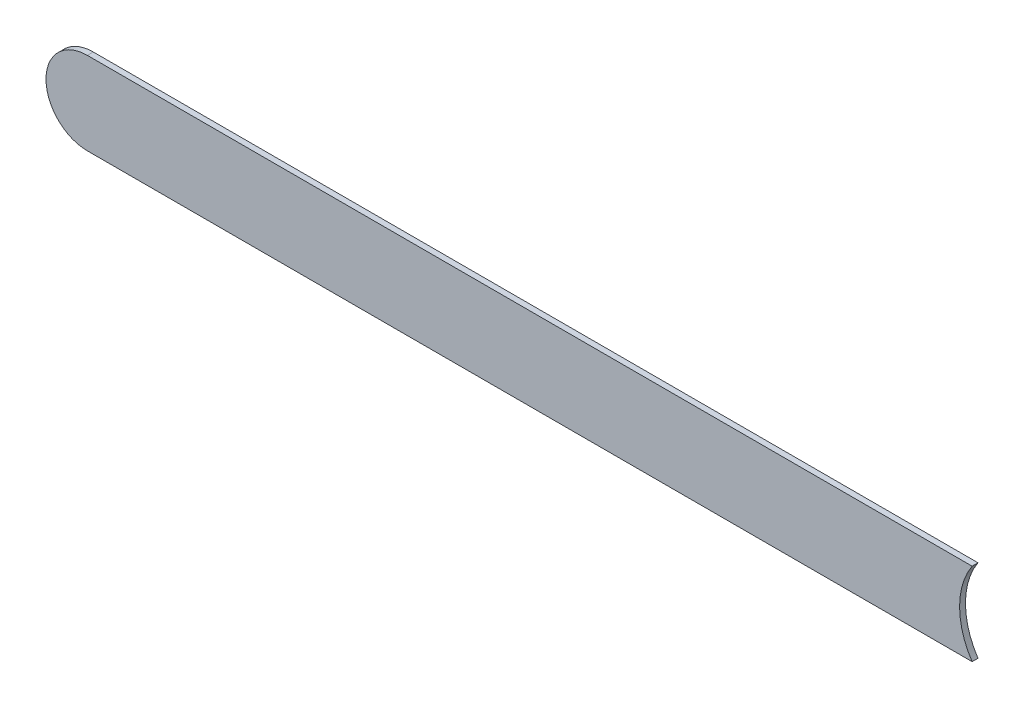
ISO-10303-21;
HEADER;
FILE_DESCRIPTION(('STEP AP214'),'2;1');
FILE_NAME('part.step','',(''),(''),'','','');
FILE_SCHEMA(('AUTOMOTIVE_DESIGN { 1 0 10303 214 1 1 1 1 }'));
ENDSEC;
DATA;
#1=APPLICATION_CONTEXT('core data for automotive mechanical design processes');
#2=APPLICATION_PROTOCOL_DEFINITION('international standard','automotive_design',2000,#1);
#3=PRODUCT_CONTEXT('',#1,'mechanical');
#4=PRODUCT('Part','Part','',(#3));
#5=PRODUCT_RELATED_PRODUCT_CATEGORY('part','',(#4));
#6=PRODUCT_DEFINITION_FORMATION('','',#4);
#7=PRODUCT_DEFINITION_CONTEXT('part definition',#1,'design');
#8=PRODUCT_DEFINITION('design','',#6,#7);
#9=PRODUCT_DEFINITION_SHAPE('','',#8);
#10=(LENGTH_UNIT() NAMED_UNIT(*) SI_UNIT(.MILLI.,.METRE.));
#11=(NAMED_UNIT(*) PLANE_ANGLE_UNIT() SI_UNIT($,.RADIAN.));
#12=(NAMED_UNIT(*) SI_UNIT($,.STERADIAN.) SOLID_ANGLE_UNIT());
#13=UNCERTAINTY_MEASURE_WITH_UNIT(LENGTH_MEASURE(1.E-05),#10,'distance_accuracy_value','');
#14=(GEOMETRIC_REPRESENTATION_CONTEXT(3) GLOBAL_UNCERTAINTY_ASSIGNED_CONTEXT((#13)) GLOBAL_UNIT_ASSIGNED_CONTEXT((#10,
#11,#12)) REPRESENTATION_CONTEXT('',''));
#15=CARTESIAN_POINT('',(0.,0.,0.));
#16=DIRECTION('',(0.,0.,1.));
#17=DIRECTION('',(1.,0.,0.));
#18=AXIS2_PLACEMENT_3D('',#15,#16,#17);
#19=CARTESIAN_POINT('',(42.38801022,114.2380113,0.));
#20=DIRECTION('',(0.,1.,0.));
#21=DIRECTION('',(1.,0.,0.));
#22=AXIS2_PLACEMENT_3D('',#19,#20,#21);
#23=PLANE('',#22);
#24=DIRECTION('',(1.,0.,0.));
#25=VECTOR('',#24,1.);
#26=CARTESIAN_POINT('',(42.38801022,114.2380113,0.03556));
#27=LINE('',#26,#25);
#28=CARTESIAN_POINT('',(42.38801022,114.2380113,0.03556));
#29=VERTEX_POINT('',#28);
#30=CARTESIAN_POINT('',(47.7368386096541,114.2380113,0.03556));
#31=VERTEX_POINT('',#30);
#32=EDGE_CURVE('E11',#29,#31,#27,.T.);
#33=ORIENTED_EDGE('',*,*,#32,.F.);
#34=DIRECTION('',(0.,0.,1.));
#35=VECTOR('',#34,1.);
#36=CARTESIAN_POINT('',(42.38801022,114.2380113,0.));
#37=LINE('',#36,#35);
#38=CARTESIAN_POINT('',(42.38801022,114.2380113,0.));
#39=VERTEX_POINT('',#38);
#40=EDGE_CURVE('E24',#39,#29,#37,.T.);
#41=ORIENTED_EDGE('',*,*,#40,.F.);
#42=DIRECTION('',(1.,0.,0.));
#43=VECTOR('',#42,1.);
#44=CARTESIAN_POINT('',(42.38801022,114.2380113,0.));
#45=LINE('',#44,#43);
#46=CARTESIAN_POINT('',(47.7368386096541,114.2380113,0.));
#47=VERTEX_POINT('',#46);
#48=EDGE_CURVE('E75',#39,#47,#45,.T.);
#49=ORIENTED_EDGE('',*,*,#48,.T.);
#50=DIRECTION('',(0.,0.,1.));
#51=VECTOR('',#50,1.);
#52=CARTESIAN_POINT('',(47.7368386096541,114.2380113,0.));
#53=LINE('',#52,#51);
#54=EDGE_CURVE('E37',#47,#31,#53,.T.);
#55=ORIENTED_EDGE('',*,*,#54,.T.);
#56=EDGE_LOOP('',(#33,#41,#49,#55));
#57=FACE_BOUND('',#56,.T.);
#58=ADVANCED_FACE('F17',(#57),#23,.F.);
#59=CARTESIAN_POINT('',(48.1110036,114.4880108,0.));
#60=DIRECTION('',(0.,0.,-1.));
#61=DIRECTION('',(1.,0.,0.));
#62=AXIS2_PLACEMENT_3D('',#59,#60,#61);
#63=CYLINDRICAL_SURFACE('',#62,0.4499991);
#64=DIRECTION('',(0.,0.,1.));
#65=VECTOR('',#64,1.);
#66=CARTESIAN_POINT('',(47.7368386096541,114.7380103,0.));
#67=LINE('',#66,#65);
#68=CARTESIAN_POINT('',(47.7368386096541,114.7380103,0.));
#69=VERTEX_POINT('',#68);
#70=CARTESIAN_POINT('',(47.7368386096541,114.7380103,0.03556));
#71=VERTEX_POINT('',#70);
#72=EDGE_CURVE('E67',#69,#71,#67,.T.);
#73=ORIENTED_EDGE('',*,*,#72,.T.);
#74=CARTESIAN_POINT('',(48.1110036,114.4880108,0.03556));
#75=DIRECTION('',(0.,0.,1.));
#76=DIRECTION('',(1.,0.,0.));
#77=AXIS2_PLACEMENT_3D('',#74,#75,#76);
#78=CIRCLE('',#77,0.4499991);
#79=EDGE_CURVE('E82',#71,#31,#78,.T.);
#80=ORIENTED_EDGE('',*,*,#79,.T.);
#81=ORIENTED_EDGE('',*,*,#54,.F.);
#82=CARTESIAN_POINT('',(48.1110036,114.4880108,0.));
#83=DIRECTION('',(0.,0.,1.));
#84=DIRECTION('',(1.,0.,0.));
#85=AXIS2_PLACEMENT_3D('',#82,#83,#84);
#86=CIRCLE('',#85,0.4499991);
#87=EDGE_CURVE('E80',#69,#47,#86,.T.);
#88=ORIENTED_EDGE('',*,*,#87,.F.);
#89=EDGE_LOOP('',(#73,#80,#81,#88));
#90=FACE_BOUND('',#89,.T.);
#91=ADVANCED_FACE('F88',(#90),#63,.F.);
#92=CARTESIAN_POINT('',(47.7368386096541,114.7380103,0.));
#93=DIRECTION('',(0.,-1.,0.));
#94=DIRECTION('',(-1.,0.,0.));
#95=AXIS2_PLACEMENT_3D('',#92,#93,#94);
#96=PLANE('',#95);
#97=DIRECTION('',(-1.,0.,0.));
#98=VECTOR('',#97,1.);
#99=CARTESIAN_POINT('',(48.1110036,114.7380103,0.03556));
#100=LINE('',#99,#98);
#101=CARTESIAN_POINT('',(42.38801022,114.7380103,0.03556));
#102=VERTEX_POINT('',#101);
#103=EDGE_CURVE('E71',#71,#102,#100,.T.);
#104=ORIENTED_EDGE('',*,*,#103,.F.);
#105=ORIENTED_EDGE('',*,*,#72,.F.);
#106=DIRECTION('',(-1.,0.,0.));
#107=VECTOR('',#106,1.);
#108=CARTESIAN_POINT('',(48.1110036,114.7380103,0.));
#109=LINE('',#108,#107);
#110=CARTESIAN_POINT('',(42.38801022,114.7380103,0.));
#111=VERTEX_POINT('',#110);
#112=EDGE_CURVE('E63',#69,#111,#109,.T.);
#113=ORIENTED_EDGE('',*,*,#112,.T.);
#114=DIRECTION('',(0.,0.,1.));
#115=VECTOR('',#114,1.);
#116=CARTESIAN_POINT('',(42.38801022,114.7380103,0.));
#117=LINE('',#116,#115);
#118=EDGE_CURVE('E53',#111,#102,#117,.T.);
#119=ORIENTED_EDGE('',*,*,#118,.T.);
#120=EDGE_LOOP('',(#104,#105,#113,#119));
#121=FACE_BOUND('',#120,.T.);
#122=ADVANCED_FACE('F66',(#121),#96,.F.);
#123=CARTESIAN_POINT('',(42.38801022,114.4880108,0.));
#124=DIRECTION('',(0.,0.,-1.));
#125=DIRECTION('',(0.,1.,0.));
#126=AXIS2_PLACEMENT_3D('',#123,#124,#125);
#127=CYLINDRICAL_SURFACE('',#126,0.249999499999994);
#128=CARTESIAN_POINT('',(42.38801022,114.4880108,0.03556));
#129=DIRECTION('',(0.,0.,1.));
#130=DIRECTION('',(0.,1.,0.));
#131=AXIS2_PLACEMENT_3D('',#128,#129,#130);
#132=CIRCLE('',#131,0.249999499999994);
#133=EDGE_CURVE('E59',#102,#29,#132,.T.);
#134=ORIENTED_EDGE('',*,*,#133,.F.);
#135=ORIENTED_EDGE('',*,*,#118,.F.);
#136=CARTESIAN_POINT('',(42.38801022,114.4880108,0.));
#137=DIRECTION('',(0.,0.,1.));
#138=DIRECTION('',(0.,1.,0.));
#139=AXIS2_PLACEMENT_3D('',#136,#137,#138);
#140=CIRCLE('',#139,0.249999499999994);
#141=EDGE_CURVE('E57',#111,#39,#140,.T.);
#142=ORIENTED_EDGE('',*,*,#141,.T.);
#143=ORIENTED_EDGE('',*,*,#40,.T.);
#144=EDGE_LOOP('',(#134,#135,#142,#143));
#145=FACE_BOUND('',#144,.T.);
#146=ADVANCED_FACE('F55',(#145),#127,.T.);
#147=CARTESIAN_POINT('',(42.38801022,114.2380113,0.));
#148=DIRECTION('',(0.,0.,-1.));
#149=DIRECTION('',(-1.,0.,0.));
#150=AXIS2_PLACEMENT_3D('',#147,#148,#149);
#151=PLANE('',#150);
#152=ORIENTED_EDGE('',*,*,#48,.F.);
#153=ORIENTED_EDGE('',*,*,#141,.F.);
#154=ORIENTED_EDGE('',*,*,#112,.F.);
#155=ORIENTED_EDGE('',*,*,#87,.T.);
#156=EDGE_LOOP('',(#152,#153,#154,#155));
#157=FACE_BOUND('',#156,.T.);
#158=ADVANCED_FACE('F74',(#157),#151,.T.);
#159=CARTESIAN_POINT('',(42.38801022,114.2380113,0.03556));
#160=DIRECTION('',(0.,0.,-1.));
#161=DIRECTION('',(-1.,0.,0.));
#162=AXIS2_PLACEMENT_3D('',#159,#160,#161);
#163=PLANE('',#162);
#164=ORIENTED_EDGE('',*,*,#133,.T.);
#165=ORIENTED_EDGE('',*,*,#32,.T.);
#166=ORIENTED_EDGE('',*,*,#79,.F.);
#167=ORIENTED_EDGE('',*,*,#103,.T.);
#168=EDGE_LOOP('',(#164,#165,#166,#167));
#169=FACE_BOUND('',#168,.T.);
#170=ADVANCED_FACE('F91',(#169),#163,.F.);
#171=CLOSED_SHELL('',(#58,#91,#122,#146,#158,#170));
#172=MANIFOLD_SOLID_BREP('B1',#171);
#173=ADVANCED_BREP_SHAPE_REPRESENTATION('',(#18,#172),#14);
#174=SHAPE_DEFINITION_REPRESENTATION(#9,#173);
ENDSEC;
END-ISO-10303-21;
